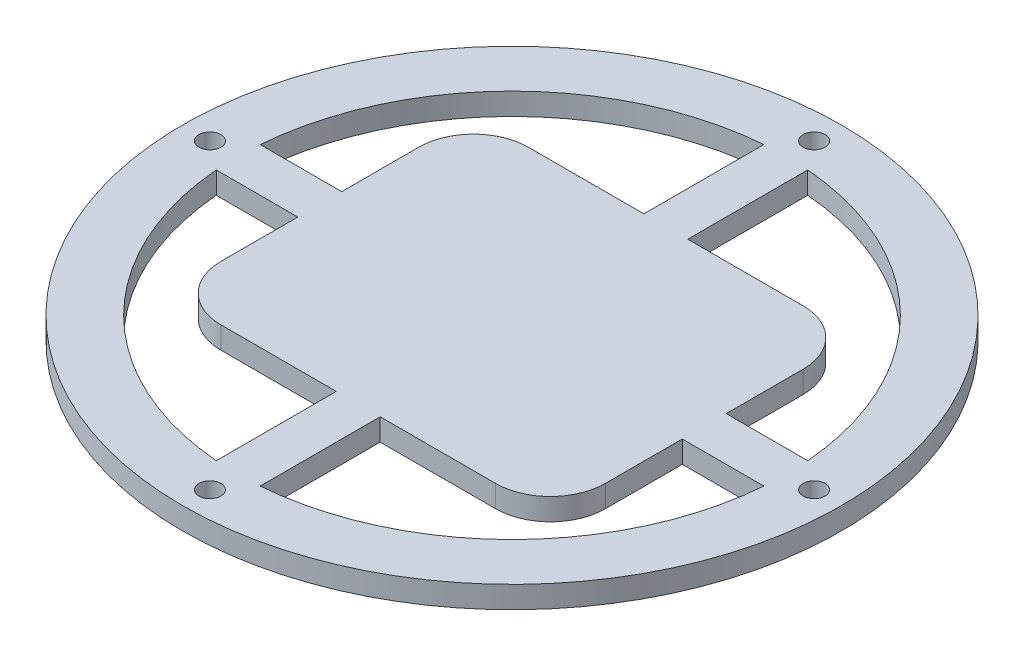
ISO-10303-21;
HEADER;
FILE_DESCRIPTION(('STEP AP214'),'2;1');
FILE_NAME('part.step','',(''),(''),'','','');
FILE_SCHEMA(('AUTOMOTIVE_DESIGN { 1 0 10303 214 1 1 1 1 }'));
ENDSEC;
DATA;
#1=APPLICATION_CONTEXT('core data for automotive mechanical design processes');
#2=APPLICATION_PROTOCOL_DEFINITION('international standard','automotive_design',2000,#1);
#3=PRODUCT_CONTEXT('',#1,'mechanical');
#4=PRODUCT('Part','Part','',(#3));
#5=PRODUCT_RELATED_PRODUCT_CATEGORY('part','',(#4));
#6=PRODUCT_DEFINITION_FORMATION('','',#4);
#7=PRODUCT_DEFINITION_CONTEXT('part definition',#1,'design');
#8=PRODUCT_DEFINITION('design','',#6,#7);
#9=PRODUCT_DEFINITION_SHAPE('','',#8);
#10=(LENGTH_UNIT() NAMED_UNIT(*) SI_UNIT(.MILLI.,.METRE.));
#11=(NAMED_UNIT(*) PLANE_ANGLE_UNIT() SI_UNIT($,.RADIAN.));
#12=(NAMED_UNIT(*) SI_UNIT($,.STERADIAN.) SOLID_ANGLE_UNIT());
#13=UNCERTAINTY_MEASURE_WITH_UNIT(LENGTH_MEASURE(1.E-05),#10,'distance_accuracy_value','');
#14=(GEOMETRIC_REPRESENTATION_CONTEXT(3) GLOBAL_UNCERTAINTY_ASSIGNED_CONTEXT((#13)) GLOBAL_UNIT_ASSIGNED_CONTEXT((#10,
#11,#12)) REPRESENTATION_CONTEXT('',''));
#15=CARTESIAN_POINT('',(0.,0.,0.));
#16=DIRECTION('',(0.,0.,1.));
#17=DIRECTION('',(1.,0.,0.));
#18=AXIS2_PLACEMENT_3D('',#15,#16,#17);
#19=CARTESIAN_POINT('',(0.,2.,0.));
#20=DIRECTION('',(0.,-1.,0.));
#21=DIRECTION('',(0.,0.,-1.));
#22=AXIS2_PLACEMENT_3D('',#19,#20,#21);
#23=CYLINDRICAL_SURFACE('',#22,25.);
#24=CARTESIAN_POINT('',(0.,2.,0.));
#25=DIRECTION('',(0.,1.,0.));
#26=DIRECTION('',(0.,0.,1.));
#27=AXIS2_PLACEMENT_3D('',#24,#25,#26);
#28=CIRCLE('',#27,25.);
#29=CARTESIAN_POINT('',(-2.,2.,-24.9198715887542));
#30=VERTEX_POINT('',#29);
#31=CARTESIAN_POINT('',(-24.9198715887542,2.,-2.));
#32=VERTEX_POINT('',#31);
#33=EDGE_CURVE('E211',#30,#32,#28,.T.);
#34=ORIENTED_EDGE('',*,*,#33,.T.);
#35=DIRECTION('',(0.,-1.,0.));
#36=VECTOR('',#35,1.);
#37=CARTESIAN_POINT('',(-24.9198715887542,2.,-2.));
#38=LINE('',#37,#36);
#39=CARTESIAN_POINT('',(-24.9198715887542,0.,-2.));
#40=VERTEX_POINT('',#39);
#41=EDGE_CURVE('E220',#32,#40,#38,.T.);
#42=ORIENTED_EDGE('',*,*,#41,.T.);
#43=CARTESIAN_POINT('',(0.,0.,0.));
#44=DIRECTION('',(0.,1.,0.));
#45=DIRECTION('',(0.,0.,1.));
#46=AXIS2_PLACEMENT_3D('',#43,#44,#45);
#47=CIRCLE('',#46,25.);
#48=CARTESIAN_POINT('',(-2.,0.,-24.9198715887542));
#49=VERTEX_POINT('',#48);
#50=EDGE_CURVE('E495',#49,#40,#47,.T.);
#51=ORIENTED_EDGE('',*,*,#50,.F.);
#52=DIRECTION('',(0.,-1.,0.));
#53=VECTOR('',#52,1.);
#54=CARTESIAN_POINT('',(-2.,2.,-24.9198715887542));
#55=LINE('',#54,#53);
#56=EDGE_CURVE('E233',#30,#49,#55,.T.);
#57=ORIENTED_EDGE('',*,*,#56,.F.);
#58=EDGE_LOOP('',(#34,#42,#51,#57));
#59=FACE_BOUND('',#58,.T.);
#60=ADVANCED_FACE('F41',(#59),#23,.F.);
#61=DIRECTION('',(0.,-1.,0.));
#62=VECTOR('',#61,1.);
#63=CARTESIAN_POINT('',(-24.9198715887542,2.,2.));
#64=LINE('',#63,#62);
#65=CARTESIAN_POINT('',(-24.9198715887542,2.,2.));
#66=VERTEX_POINT('',#65);
#67=CARTESIAN_POINT('',(-24.9198715887542,0.,2.));
#68=VERTEX_POINT('',#67);
#69=EDGE_CURVE('E229',#66,#68,#64,.T.);
#70=ORIENTED_EDGE('',*,*,#69,.F.);
#71=CARTESIAN_POINT('',(-2.,2.,24.9198715887542));
#72=VERTEX_POINT('',#71);
#73=EDGE_CURVE('E236',#66,#72,#28,.T.);
#74=ORIENTED_EDGE('',*,*,#73,.T.);
#75=DIRECTION('',(0.,-1.,0.));
#76=VECTOR('',#75,1.);
#77=CARTESIAN_POINT('',(-2.,2.,24.9198715887542));
#78=LINE('',#77,#76);
#79=CARTESIAN_POINT('',(-2.,0.,24.9198715887542));
#80=VERTEX_POINT('',#79);
#81=EDGE_CURVE('E390',#72,#80,#78,.T.);
#82=ORIENTED_EDGE('',*,*,#81,.T.);
#83=EDGE_CURVE('E254',#68,#80,#47,.T.);
#84=ORIENTED_EDGE('',*,*,#83,.F.);
#85=EDGE_LOOP('',(#70,#74,#82,#84));
#86=FACE_BOUND('',#85,.T.);
#87=ADVANCED_FACE('F454',(#86),#23,.F.);
#88=DIRECTION('',(0.,-1.,0.));
#89=VECTOR('',#88,1.);
#90=CARTESIAN_POINT('',(2.,2.,24.9198715887542));
#91=LINE('',#90,#89);
#92=CARTESIAN_POINT('',(2.,2.,24.9198715887542));
#93=VERTEX_POINT('',#92);
#94=CARTESIAN_POINT('',(2.,0.,24.9198715887542));
#95=VERTEX_POINT('',#94);
#96=EDGE_CURVE('E386',#93,#95,#91,.T.);
#97=ORIENTED_EDGE('',*,*,#96,.F.);
#98=CARTESIAN_POINT('',(24.9198715887542,2.,2.));
#99=VERTEX_POINT('',#98);
#100=EDGE_CURVE('E241',#93,#99,#28,.T.);
#101=ORIENTED_EDGE('',*,*,#100,.T.);
#102=DIRECTION('',(0.,-1.,0.));
#103=VECTOR('',#102,1.);
#104=CARTESIAN_POINT('',(24.9198715887542,2.,2.));
#105=LINE('',#104,#103);
#106=CARTESIAN_POINT('',(24.9198715887542,0.,2.));
#107=VERTEX_POINT('',#106);
#108=EDGE_CURVE('E375',#99,#107,#105,.T.);
#109=ORIENTED_EDGE('',*,*,#108,.T.);
#110=EDGE_CURVE('E243',#95,#107,#47,.T.);
#111=ORIENTED_EDGE('',*,*,#110,.F.);
#112=EDGE_LOOP('',(#97,#101,#109,#111));
#113=FACE_BOUND('',#112,.T.);
#114=ADVANCED_FACE('F459',(#113),#23,.F.);
#115=DIRECTION('',(0.,-1.,0.));
#116=VECTOR('',#115,1.);
#117=CARTESIAN_POINT('',(24.9198715887542,2.,-2.));
#118=LINE('',#117,#116);
#119=CARTESIAN_POINT('',(24.9198715887542,2.,-2.));
#120=VERTEX_POINT('',#119);
#121=CARTESIAN_POINT('',(24.9198715887542,0.,-2.));
#122=VERTEX_POINT('',#121);
#123=EDGE_CURVE('E371',#120,#122,#118,.T.);
#124=ORIENTED_EDGE('',*,*,#123,.F.);
#125=CARTESIAN_POINT('',(2.,2.,-24.9198715887542));
#126=VERTEX_POINT('',#125);
#127=EDGE_CURVE('E235',#120,#126,#28,.T.);
#128=ORIENTED_EDGE('',*,*,#127,.T.);
#129=DIRECTION('',(0.,-1.,0.));
#130=VECTOR('',#129,1.);
#131=CARTESIAN_POINT('',(2.,2.,-24.9198715887542));
#132=LINE('',#131,#130);
#133=CARTESIAN_POINT('',(2.,0.,-24.9198715887542));
#134=VERTEX_POINT('',#133);
#135=EDGE_CURVE('E360',#126,#134,#132,.T.);
#136=ORIENTED_EDGE('',*,*,#135,.T.);
#137=EDGE_CURVE('E253',#122,#134,#47,.T.);
#138=ORIENTED_EDGE('',*,*,#137,.F.);
#139=EDGE_LOOP('',(#124,#128,#136,#138));
#140=FACE_BOUND('',#139,.T.);
#141=ADVANCED_FACE('F455',(#140),#23,.F.);
#142=CARTESIAN_POINT('',(0.,2.,0.));
#143=DIRECTION('',(0.,1.,0.));
#144=DIRECTION('',(0.,0.,1.));
#145=AXIS2_PLACEMENT_3D('',#142,#143,#144);
#146=PLANE('',#145);
#147=DIRECTION('',(0.,0.,1.));
#148=VECTOR('',#147,1.);
#149=CARTESIAN_POINT('',(17.5,2.,0.));
#150=LINE('',#149,#148);
#151=CARTESIAN_POINT('',(17.5,2.,-9.));
#152=VERTEX_POINT('',#151);
#153=CARTESIAN_POINT('',(17.5,2.,-2.));
#154=VERTEX_POINT('',#153);
#155=EDGE_CURVE('E539',#152,#154,#150,.T.);
#156=ORIENTED_EDGE('',*,*,#155,.F.);
#157=CARTESIAN_POINT('',(12.5,2.,-9.));
#158=DIRECTION('',(0.,1.,0.));
#159=DIRECTION('',(0.,0.,1.));
#160=AXIS2_PLACEMENT_3D('',#157,#158,#159);
#161=CIRCLE('',#160,5.);
#162=CARTESIAN_POINT('',(12.5,2.,-14.));
#163=VERTEX_POINT('',#162);
#164=EDGE_CURVE('E283',#152,#163,#161,.T.);
#165=ORIENTED_EDGE('',*,*,#164,.T.);
#166=DIRECTION('',(1.,0.,0.));
#167=VECTOR('',#166,1.);
#168=CARTESIAN_POINT('',(0.,2.,-14.));
#169=LINE('',#168,#167);
#170=CARTESIAN_POINT('',(2.,2.,-14.));
#171=VERTEX_POINT('',#170);
#172=EDGE_CURVE('E484',#171,#163,#169,.T.);
#173=ORIENTED_EDGE('',*,*,#172,.F.);
#174=DIRECTION('',(0.,0.,-1.));
#175=VECTOR('',#174,1.);
#176=CARTESIAN_POINT('',(2.,2.,0.));
#177=LINE('',#176,#175);
#178=EDGE_CURVE('E481',#171,#126,#177,.T.);
#179=ORIENTED_EDGE('',*,*,#178,.T.);
#180=ORIENTED_EDGE('',*,*,#127,.F.);
#181=DIRECTION('',(1.,0.,0.));
#182=VECTOR('',#181,1.);
#183=CARTESIAN_POINT('',(0.,2.,-2.));
#184=LINE('',#183,#182);
#185=EDGE_CURVE('E478',#154,#120,#184,.T.);
#186=ORIENTED_EDGE('',*,*,#185,.F.);
#187=EDGE_LOOP('',(#156,#165,#173,#179,#180,#186));
#188=FACE_BOUND('',#187,.T.);
#189=DIRECTION('',(1.,0.,0.));
#190=VECTOR('',#189,1.);
#191=CARTESIAN_POINT('',(0.,2.,-14.));
#192=LINE('',#191,#190);
#193=CARTESIAN_POINT('',(-12.5,2.,-14.));
#194=VERTEX_POINT('',#193);
#195=CARTESIAN_POINT('',(-2.,2.,-14.));
#196=VERTEX_POINT('',#195);
#197=EDGE_CURVE('E532',#194,#196,#192,.T.);
#198=ORIENTED_EDGE('',*,*,#197,.F.);
#199=CARTESIAN_POINT('',(-12.5,2.,-9.));
#200=DIRECTION('',(0.,1.,0.));
#201=DIRECTION('',(0.,0.,1.));
#202=AXIS2_PLACEMENT_3D('',#199,#200,#201);
#203=CIRCLE('',#202,5.);
#204=CARTESIAN_POINT('',(-17.5,2.,-9.));
#205=VERTEX_POINT('',#204);
#206=EDGE_CURVE('E289',#194,#205,#203,.T.);
#207=ORIENTED_EDGE('',*,*,#206,.T.);
#208=DIRECTION('',(0.,0.,-1.));
#209=VECTOR('',#208,1.);
#210=CARTESIAN_POINT('',(-17.5,2.,0.));
#211=LINE('',#210,#209);
#212=CARTESIAN_POINT('',(-17.5,2.,-2.));
#213=VERTEX_POINT('',#212);
#214=EDGE_CURVE('E213',#213,#205,#211,.T.);
#215=ORIENTED_EDGE('',*,*,#214,.F.);
#216=DIRECTION('',(-1.,0.,0.));
#217=VECTOR('',#216,1.);
#218=CARTESIAN_POINT('',(0.,2.,-2.));
#219=LINE('',#218,#217);
#220=EDGE_CURVE('E204',#213,#32,#219,.T.);
#221=ORIENTED_EDGE('',*,*,#220,.T.);
#222=ORIENTED_EDGE('',*,*,#33,.F.);
#223=DIRECTION('',(0.,0.,-1.));
#224=VECTOR('',#223,1.);
#225=CARTESIAN_POINT('',(-2.,2.,0.));
#226=LINE('',#225,#224);
#227=EDGE_CURVE('E487',#196,#30,#226,.T.);
#228=ORIENTED_EDGE('',*,*,#227,.F.);
#229=EDGE_LOOP('',(#198,#207,#215,#221,#222,#228));
#230=FACE_BOUND('',#229,.T.);
#231=DIRECTION('',(0.,0.,-1.));
#232=VECTOR('',#231,1.);
#233=CARTESIAN_POINT('',(-17.5,2.,0.));
#234=LINE('',#233,#232);
#235=CARTESIAN_POINT('',(-17.5,2.,9.));
#236=VERTEX_POINT('',#235);
#237=CARTESIAN_POINT('',(-17.5,2.,2.));
#238=VERTEX_POINT('',#237);
#239=EDGE_CURVE('E561',#236,#238,#234,.T.);
#240=ORIENTED_EDGE('',*,*,#239,.F.);
#241=CARTESIAN_POINT('',(-12.5,2.,9.));
#242=DIRECTION('',(0.,1.,0.));
#243=DIRECTION('',(0.,0.,1.));
#244=AXIS2_PLACEMENT_3D('',#241,#242,#243);
#245=CIRCLE('',#244,5.);
#246=CARTESIAN_POINT('',(-12.5,2.,14.));
#247=VERTEX_POINT('',#246);
#248=EDGE_CURVE('E286',#236,#247,#245,.T.);
#249=ORIENTED_EDGE('',*,*,#248,.T.);
#250=DIRECTION('',(-1.,0.,0.));
#251=VECTOR('',#250,1.);
#252=CARTESIAN_POINT('',(0.,2.,14.));
#253=LINE('',#252,#251);
#254=CARTESIAN_POINT('',(-2.,2.,14.));
#255=VERTEX_POINT('',#254);
#256=EDGE_CURVE('E557',#255,#247,#253,.T.);
#257=ORIENTED_EDGE('',*,*,#256,.F.);
#258=DIRECTION('',(0.,0.,1.));
#259=VECTOR('',#258,1.);
#260=CARTESIAN_POINT('',(-2.,2.,0.));
#261=LINE('',#260,#259);
#262=EDGE_CURVE('E514',#255,#72,#261,.T.);
#263=ORIENTED_EDGE('',*,*,#262,.T.);
#264=ORIENTED_EDGE('',*,*,#73,.F.);
#265=DIRECTION('',(-1.,0.,0.));
#266=VECTOR('',#265,1.);
#267=CARTESIAN_POINT('',(0.,2.,2.));
#268=LINE('',#267,#266);
#269=EDGE_CURVE('E216',#238,#66,#268,.T.);
#270=ORIENTED_EDGE('',*,*,#269,.F.);
#271=EDGE_LOOP('',(#240,#249,#257,#263,#264,#270));
#272=FACE_BOUND('',#271,.T.);
#273=CARTESIAN_POINT('',(0.,2.,-27.5));
#274=DIRECTION('',(0.,1.,0.));
#275=DIRECTION('',(0.,0.,1.));
#276=AXIS2_PLACEMENT_3D('',#273,#274,#275);
#277=CIRCLE('',#276,1.);
#278=CARTESIAN_POINT('',(0.,2.,-26.5));
#279=VERTEX_POINT('',#278);
#280=EDGE_CURVE('E408',#279,#279,#277,.T.);
#281=ORIENTED_EDGE('',*,*,#280,.F.);
#282=EDGE_LOOP('',(#281));
#283=FACE_BOUND('',#282,.T.);
#284=CARTESIAN_POINT('',(27.5,2.,0.));
#285=DIRECTION('',(0.,1.,0.));
#286=DIRECTION('',(0.,0.,1.));
#287=AXIS2_PLACEMENT_3D('',#284,#285,#286);
#288=CIRCLE('',#287,1.);
#289=CARTESIAN_POINT('',(27.5,2.,1.));
#290=VERTEX_POINT('',#289);
#291=EDGE_CURVE('E412',#290,#290,#288,.T.);
#292=ORIENTED_EDGE('',*,*,#291,.F.);
#293=EDGE_LOOP('',(#292));
#294=FACE_BOUND('',#293,.T.);
#295=CARTESIAN_POINT('',(0.,2.,27.5));
#296=DIRECTION('',(0.,1.,0.));
#297=DIRECTION('',(0.,0.,1.));
#298=AXIS2_PLACEMENT_3D('',#295,#296,#297);
#299=CIRCLE('',#298,1.);
#300=CARTESIAN_POINT('',(0.,2.,28.5));
#301=VERTEX_POINT('',#300);
#302=EDGE_CURVE('E420',#301,#301,#299,.T.);
#303=ORIENTED_EDGE('',*,*,#302,.F.);
#304=EDGE_LOOP('',(#303));
#305=FACE_BOUND('',#304,.T.);
#306=CARTESIAN_POINT('',(-27.5,2.,0.));
#307=DIRECTION('',(0.,1.,0.));
#308=DIRECTION('',(0.,0.,1.));
#309=AXIS2_PLACEMENT_3D('',#306,#307,#308);
#310=CIRCLE('',#309,1.);
#311=CARTESIAN_POINT('',(-27.5,2.,1.));
#312=VERTEX_POINT('',#311);
#313=EDGE_CURVE('E427',#312,#312,#310,.T.);
#314=ORIENTED_EDGE('',*,*,#313,.F.);
#315=EDGE_LOOP('',(#314));
#316=FACE_BOUND('',#315,.T.);
#317=CARTESIAN_POINT('',(0.,2.,0.));
#318=DIRECTION('',(0.,1.,0.));
#319=DIRECTION('',(0.,0.,1.));
#320=AXIS2_PLACEMENT_3D('',#317,#318,#319);
#321=CIRCLE('',#320,30.);
#322=CARTESIAN_POINT('',(0.,2.,30.));
#323=VERTEX_POINT('',#322);
#324=EDGE_CURVE('E255',#323,#323,#321,.T.);
#325=ORIENTED_EDGE('',*,*,#324,.T.);
#326=EDGE_LOOP('',(#325));
#327=FACE_BOUND('',#326,.T.);
#328=DIRECTION('',(-1.,0.,0.));
#329=VECTOR('',#328,1.);
#330=CARTESIAN_POINT('',(0.,2.,14.));
#331=LINE('',#330,#329);
#332=CARTESIAN_POINT('',(12.5,2.,14.));
#333=VERTEX_POINT('',#332);
#334=CARTESIAN_POINT('',(2.,2.,14.));
#335=VERTEX_POINT('',#334);
#336=EDGE_CURVE('E549',#333,#335,#331,.T.);
#337=ORIENTED_EDGE('',*,*,#336,.F.);
#338=CARTESIAN_POINT('',(12.5,2.,9.));
#339=DIRECTION('',(0.,1.,0.));
#340=DIRECTION('',(0.,0.,1.));
#341=AXIS2_PLACEMENT_3D('',#338,#339,#340);
#342=CIRCLE('',#341,5.);
#343=CARTESIAN_POINT('',(17.5,2.,9.));
#344=VERTEX_POINT('',#343);
#345=EDGE_CURVE('E57',#333,#344,#342,.T.);
#346=ORIENTED_EDGE('',*,*,#345,.T.);
#347=DIRECTION('',(0.,0.,1.));
#348=VECTOR('',#347,1.);
#349=CARTESIAN_POINT('',(17.5,2.,0.));
#350=LINE('',#349,#348);
#351=CARTESIAN_POINT('',(17.5,2.,2.));
#352=VERTEX_POINT('',#351);
#353=EDGE_CURVE('E313',#352,#344,#350,.T.);
#354=ORIENTED_EDGE('',*,*,#353,.F.);
#355=DIRECTION('',(1.,0.,0.));
#356=VECTOR('',#355,1.);
#357=CARTESIAN_POINT('',(0.,2.,2.));
#358=LINE('',#357,#356);
#359=EDGE_CURVE('E544',#352,#99,#358,.T.);
#360=ORIENTED_EDGE('',*,*,#359,.T.);
#361=ORIENTED_EDGE('',*,*,#100,.F.);
#362=DIRECTION('',(0.,0.,1.));
#363=VECTOR('',#362,1.);
#364=CARTESIAN_POINT('',(2.,2.,0.));
#365=LINE('',#364,#363);
#366=EDGE_CURVE('E552',#335,#93,#365,.T.);
#367=ORIENTED_EDGE('',*,*,#366,.F.);
#368=EDGE_LOOP('',(#337,#346,#354,#360,#361,#367));
#369=FACE_BOUND('',#368,.T.);
#370=ADVANCED_FACE('F207',(#188,#230,#272,#283,#294,#305,#316,#327,#369),#146,.T.);
#371=CARTESIAN_POINT('',(0.,0.,0.));
#372=DIRECTION('',(0.,1.,0.));
#373=DIRECTION('',(0.,0.,1.));
#374=AXIS2_PLACEMENT_3D('',#371,#372,#373);
#375=PLANE('',#374);
#376=DIRECTION('',(1.,0.,0.));
#377=VECTOR('',#376,1.);
#378=CARTESIAN_POINT('',(0.,0.,-14.));
#379=LINE('',#378,#377);
#380=CARTESIAN_POINT('',(2.,0.,-14.));
#381=VERTEX_POINT('',#380);
#382=CARTESIAN_POINT('',(12.5,0.,-14.));
#383=VERTEX_POINT('',#382);
#384=EDGE_CURVE('E335',#381,#383,#379,.T.);
#385=ORIENTED_EDGE('',*,*,#384,.T.);
#386=CARTESIAN_POINT('',(12.5,0.,-9.));
#387=DIRECTION('',(0.,1.,0.));
#388=DIRECTION('',(0.,0.,1.));
#389=AXIS2_PLACEMENT_3D('',#386,#387,#388);
#390=CIRCLE('',#389,5.);
#391=CARTESIAN_POINT('',(17.5,0.,-9.));
#392=VERTEX_POINT('',#391);
#393=EDGE_CURVE('E269',#383,#392,#390,.F.);
#394=ORIENTED_EDGE('',*,*,#393,.T.);
#395=DIRECTION('',(0.,0.,1.));
#396=VECTOR('',#395,1.);
#397=CARTESIAN_POINT('',(17.5,0.,0.));
#398=LINE('',#397,#396);
#399=CARTESIAN_POINT('',(17.5,0.,-2.));
#400=VERTEX_POINT('',#399);
#401=EDGE_CURVE('E332',#392,#400,#398,.T.);
#402=ORIENTED_EDGE('',*,*,#401,.T.);
#403=DIRECTION('',(1.,0.,0.));
#404=VECTOR('',#403,1.);
#405=CARTESIAN_POINT('',(0.,0.,-2.));
#406=LINE('',#405,#404);
#407=EDGE_CURVE('E324',#400,#122,#406,.T.);
#408=ORIENTED_EDGE('',*,*,#407,.T.);
#409=ORIENTED_EDGE('',*,*,#137,.T.);
#410=DIRECTION('',(0.,0.,-1.));
#411=VECTOR('',#410,1.);
#412=CARTESIAN_POINT('',(2.,0.,0.));
#413=LINE('',#412,#411);
#414=EDGE_CURVE('E339',#381,#134,#413,.T.);
#415=ORIENTED_EDGE('',*,*,#414,.F.);
#416=EDGE_LOOP('',(#385,#394,#402,#408,#409,#415));
#417=FACE_BOUND('',#416,.T.);
#418=DIRECTION('',(0.,0.,-1.));
#419=VECTOR('',#418,1.);
#420=CARTESIAN_POINT('',(-17.5,0.,0.));
#421=LINE('',#420,#419);
#422=CARTESIAN_POINT('',(-17.5,0.,-2.));
#423=VERTEX_POINT('',#422);
#424=CARTESIAN_POINT('',(-17.5,0.,-9.));
#425=VERTEX_POINT('',#424);
#426=EDGE_CURVE('E217',#423,#425,#421,.T.);
#427=ORIENTED_EDGE('',*,*,#426,.T.);
#428=CARTESIAN_POINT('',(-12.5,0.,-9.));
#429=DIRECTION('',(0.,1.,0.));
#430=DIRECTION('',(0.,0.,1.));
#431=AXIS2_PLACEMENT_3D('',#428,#429,#430);
#432=CIRCLE('',#431,5.);
#433=CARTESIAN_POINT('',(-12.5,0.,-14.));
#434=VERTEX_POINT('',#433);
#435=EDGE_CURVE('E275',#425,#434,#432,.F.);
#436=ORIENTED_EDGE('',*,*,#435,.T.);
#437=DIRECTION('',(1.,0.,0.));
#438=VECTOR('',#437,1.);
#439=CARTESIAN_POINT('',(0.,0.,-14.));
#440=LINE('',#439,#438);
#441=CARTESIAN_POINT('',(-2.,0.,-14.));
#442=VERTEX_POINT('',#441);
#443=EDGE_CURVE('E345',#434,#442,#440,.T.);
#444=ORIENTED_EDGE('',*,*,#443,.T.);
#445=DIRECTION('',(0.,0.,-1.));
#446=VECTOR('',#445,1.);
#447=CARTESIAN_POINT('',(-2.,0.,0.));
#448=LINE('',#447,#446);
#449=EDGE_CURVE('E342',#442,#49,#448,.T.);
#450=ORIENTED_EDGE('',*,*,#449,.T.);
#451=ORIENTED_EDGE('',*,*,#50,.T.);
#452=DIRECTION('',(-1.,0.,0.));
#453=VECTOR('',#452,1.);
#454=CARTESIAN_POINT('',(0.,0.,-2.));
#455=LINE('',#454,#453);
#456=EDGE_CURVE('E223',#423,#40,#455,.T.);
#457=ORIENTED_EDGE('',*,*,#456,.F.);
#458=EDGE_LOOP('',(#427,#436,#444,#450,#451,#457));
#459=FACE_BOUND('',#458,.T.);
#460=DIRECTION('',(-1.,0.,0.));
#461=VECTOR('',#460,1.);
#462=CARTESIAN_POINT('',(0.,0.,14.));
#463=LINE('',#462,#461);
#464=CARTESIAN_POINT('',(-2.,0.,14.));
#465=VERTEX_POINT('',#464);
#466=CARTESIAN_POINT('',(-12.5,0.,14.));
#467=VERTEX_POINT('',#466);
#468=EDGE_CURVE('E517',#465,#467,#463,.T.);
#469=ORIENTED_EDGE('',*,*,#468,.T.);
#470=CARTESIAN_POINT('',(-12.5,0.,9.));
#471=DIRECTION('',(0.,1.,0.));
#472=DIRECTION('',(0.,0.,1.));
#473=AXIS2_PLACEMENT_3D('',#470,#471,#472);
#474=CIRCLE('',#473,5.);
#475=CARTESIAN_POINT('',(-17.5,0.,9.));
#476=VERTEX_POINT('',#475);
#477=EDGE_CURVE('E272',#467,#476,#474,.F.);
#478=ORIENTED_EDGE('',*,*,#477,.T.);
#479=DIRECTION('',(0.,0.,-1.));
#480=VECTOR('',#479,1.);
#481=CARTESIAN_POINT('',(-17.5,0.,0.));
#482=LINE('',#481,#480);
#483=CARTESIAN_POINT('',(-17.5,0.,2.));
#484=VERTEX_POINT('',#483);
#485=EDGE_CURVE('E521',#476,#484,#482,.T.);
#486=ORIENTED_EDGE('',*,*,#485,.T.);
#487=DIRECTION('',(-1.,0.,0.));
#488=VECTOR('',#487,1.);
#489=CARTESIAN_POINT('',(0.,0.,2.));
#490=LINE('',#489,#488);
#491=EDGE_CURVE('E507',#484,#68,#490,.T.);
#492=ORIENTED_EDGE('',*,*,#491,.T.);
#493=ORIENTED_EDGE('',*,*,#83,.T.);
#494=DIRECTION('',(0.,0.,1.));
#495=VECTOR('',#494,1.);
#496=CARTESIAN_POINT('',(-2.,0.,0.));
#497=LINE('',#496,#495);
#498=EDGE_CURVE('E504',#465,#80,#497,.T.);
#499=ORIENTED_EDGE('',*,*,#498,.F.);
#500=EDGE_LOOP('',(#469,#478,#486,#492,#493,#499));
#501=FACE_BOUND('',#500,.T.);
#502=CARTESIAN_POINT('',(0.,0.,-27.5));
#503=DIRECTION('',(0.,1.,0.));
#504=DIRECTION('',(0.,0.,1.));
#505=AXIS2_PLACEMENT_3D('',#502,#503,#504);
#506=CIRCLE('',#505,1.);
#507=CARTESIAN_POINT('',(0.,0.,-26.5));
#508=VERTEX_POINT('',#507);
#509=EDGE_CURVE('E404',#508,#508,#506,.T.);
#510=ORIENTED_EDGE('',*,*,#509,.T.);
#511=EDGE_LOOP('',(#510));
#512=FACE_BOUND('',#511,.T.);
#513=CARTESIAN_POINT('',(27.5,0.,0.));
#514=DIRECTION('',(0.,1.,0.));
#515=DIRECTION('',(0.,0.,1.));
#516=AXIS2_PLACEMENT_3D('',#513,#514,#515);
#517=CIRCLE('',#516,1.);
#518=CARTESIAN_POINT('',(27.5,0.,1.));
#519=VERTEX_POINT('',#518);
#520=EDGE_CURVE('E416',#519,#519,#517,.T.);
#521=ORIENTED_EDGE('',*,*,#520,.T.);
#522=EDGE_LOOP('',(#521));
#523=FACE_BOUND('',#522,.T.);
#524=CARTESIAN_POINT('',(0.,0.,27.5));
#525=DIRECTION('',(0.,1.,0.));
#526=DIRECTION('',(0.,0.,1.));
#527=AXIS2_PLACEMENT_3D('',#524,#525,#526);
#528=CIRCLE('',#527,1.);
#529=CARTESIAN_POINT('',(0.,0.,28.5));
#530=VERTEX_POINT('',#529);
#531=EDGE_CURVE('E424',#530,#530,#528,.T.);
#532=ORIENTED_EDGE('',*,*,#531,.T.);
#533=EDGE_LOOP('',(#532));
#534=FACE_BOUND('',#533,.T.);
#535=CARTESIAN_POINT('',(-27.5,0.,0.));
#536=DIRECTION('',(0.,1.,0.));
#537=DIRECTION('',(0.,0.,1.));
#538=AXIS2_PLACEMENT_3D('',#535,#536,#537);
#539=CIRCLE('',#538,1.);
#540=CARTESIAN_POINT('',(-27.5,0.,1.));
#541=VERTEX_POINT('',#540);
#542=EDGE_CURVE('E228',#541,#541,#539,.T.);
#543=ORIENTED_EDGE('',*,*,#542,.T.);
#544=EDGE_LOOP('',(#543));
#545=FACE_BOUND('',#544,.T.);
#546=CARTESIAN_POINT('',(0.,0.,0.));
#547=DIRECTION('',(0.,1.,0.));
#548=DIRECTION('',(0.,0.,1.));
#549=AXIS2_PLACEMENT_3D('',#546,#547,#548);
#550=CIRCLE('',#549,30.);
#551=CARTESIAN_POINT('',(0.,0.,30.));
#552=VERTEX_POINT('',#551);
#553=EDGE_CURVE('E248',#552,#552,#550,.T.);
#554=ORIENTED_EDGE('',*,*,#553,.F.);
#555=EDGE_LOOP('',(#554));
#556=FACE_BOUND('',#555,.T.);
#557=DIRECTION('',(0.,0.,1.));
#558=VECTOR('',#557,1.);
#559=CARTESIAN_POINT('',(17.5,0.,0.));
#560=LINE('',#559,#558);
#561=CARTESIAN_POINT('',(17.5,0.,2.));
#562=VERTEX_POINT('',#561);
#563=CARTESIAN_POINT('',(17.5,0.,9.));
#564=VERTEX_POINT('',#563);
#565=EDGE_CURVE('E312',#562,#564,#560,.T.);
#566=ORIENTED_EDGE('',*,*,#565,.T.);
#567=CARTESIAN_POINT('',(12.5,0.,9.));
#568=DIRECTION('',(0.,1.,0.));
#569=DIRECTION('',(0.,0.,1.));
#570=AXIS2_PLACEMENT_3D('',#567,#568,#569);
#571=CIRCLE('',#570,5.);
#572=CARTESIAN_POINT('',(12.5,0.,14.));
#573=VERTEX_POINT('',#572);
#574=EDGE_CURVE('E266',#564,#573,#571,.F.);
#575=ORIENTED_EDGE('',*,*,#574,.T.);
#576=DIRECTION('',(-1.,0.,0.));
#577=VECTOR('',#576,1.);
#578=CARTESIAN_POINT('',(0.,0.,14.));
#579=LINE('',#578,#577);
#580=CARTESIAN_POINT('',(2.,0.,14.));
#581=VERTEX_POINT('',#580);
#582=EDGE_CURVE('E320',#573,#581,#579,.T.);
#583=ORIENTED_EDGE('',*,*,#582,.T.);
#584=DIRECTION('',(0.,0.,1.));
#585=VECTOR('',#584,1.);
#586=CARTESIAN_POINT('',(2.,0.,0.));
#587=LINE('',#586,#585);
#588=EDGE_CURVE('E326',#581,#95,#587,.T.);
#589=ORIENTED_EDGE('',*,*,#588,.T.);
#590=ORIENTED_EDGE('',*,*,#110,.T.);
#591=DIRECTION('',(1.,0.,0.));
#592=VECTOR('',#591,1.);
#593=CARTESIAN_POINT('',(0.,0.,2.));
#594=LINE('',#593,#592);
#595=EDGE_CURVE('E318',#562,#107,#594,.T.);
#596=ORIENTED_EDGE('',*,*,#595,.F.);
#597=EDGE_LOOP('',(#566,#575,#583,#589,#590,#596));
#598=FACE_BOUND('',#597,.T.);
#599=ADVANCED_FACE('F317',(#417,#459,#501,#512,#523,#534,#545,#556,#598),#375,.F.);
#600=CARTESIAN_POINT('',(0.,2.,0.));
#601=DIRECTION('',(0.,-1.,0.));
#602=DIRECTION('',(0.,0.,-1.));
#603=AXIS2_PLACEMENT_3D('',#600,#601,#602);
#604=CYLINDRICAL_SURFACE('',#603,30.);
#605=ORIENTED_EDGE('',*,*,#324,.F.);
#606=EDGE_LOOP('',(#605));
#607=FACE_BOUND('',#606,.T.);
#608=ORIENTED_EDGE('',*,*,#553,.T.);
#609=EDGE_LOOP('',(#608));
#610=FACE_BOUND('',#609,.T.);
#611=ADVANCED_FACE('F441',(#607,#610),#604,.T.);
#612=CARTESIAN_POINT('',(-27.5,0.,0.));
#613=DIRECTION('',(0.,1.,0.));
#614=DIRECTION('',(0.,0.,1.));
#615=AXIS2_PLACEMENT_3D('',#612,#613,#614);
#616=CYLINDRICAL_SURFACE('',#615,1.);
#617=ORIENTED_EDGE('',*,*,#542,.F.);
#618=EDGE_LOOP('',(#617));
#619=FACE_BOUND('',#618,.T.);
#620=ORIENTED_EDGE('',*,*,#313,.T.);
#621=EDGE_LOOP('',(#620));
#622=FACE_BOUND('',#621,.T.);
#623=ADVANCED_FACE('F438',(#619,#622),#616,.F.);
#624=CARTESIAN_POINT('',(0.,0.,27.5));
#625=DIRECTION('',(0.,1.,0.));
#626=DIRECTION('',(0.,0.,1.));
#627=AXIS2_PLACEMENT_3D('',#624,#625,#626);
#628=CYLINDRICAL_SURFACE('',#627,1.);
#629=ORIENTED_EDGE('',*,*,#531,.F.);
#630=EDGE_LOOP('',(#629));
#631=FACE_BOUND('',#630,.T.);
#632=ORIENTED_EDGE('',*,*,#302,.T.);
#633=EDGE_LOOP('',(#632));
#634=FACE_BOUND('',#633,.T.);
#635=ADVANCED_FACE('F440',(#631,#634),#628,.F.);
#636=CARTESIAN_POINT('',(27.5,0.,0.));
#637=DIRECTION('',(0.,1.,0.));
#638=DIRECTION('',(0.,0.,1.));
#639=AXIS2_PLACEMENT_3D('',#636,#637,#638);
#640=CYLINDRICAL_SURFACE('',#639,1.);
#641=ORIENTED_EDGE('',*,*,#520,.F.);
#642=EDGE_LOOP('',(#641));
#643=FACE_BOUND('',#642,.T.);
#644=ORIENTED_EDGE('',*,*,#291,.T.);
#645=EDGE_LOOP('',(#644));
#646=FACE_BOUND('',#645,.T.);
#647=ADVANCED_FACE('F447',(#643,#646),#640,.F.);
#648=CARTESIAN_POINT('',(0.,0.,-27.5));
#649=DIRECTION('',(0.,1.,0.));
#650=DIRECTION('',(0.,0.,1.));
#651=AXIS2_PLACEMENT_3D('',#648,#649,#650);
#652=CYLINDRICAL_SURFACE('',#651,1.);
#653=ORIENTED_EDGE('',*,*,#509,.F.);
#654=EDGE_LOOP('',(#653));
#655=FACE_BOUND('',#654,.T.);
#656=ORIENTED_EDGE('',*,*,#280,.T.);
#657=EDGE_LOOP('',(#656));
#658=FACE_BOUND('',#657,.T.);
#659=ADVANCED_FACE('F593',(#655,#658),#652,.F.);
#660=CARTESIAN_POINT('',(0.,2.,-2.));
#661=DIRECTION('',(0.,0.,1.));
#662=DIRECTION('',(1.,0.,0.));
#663=AXIS2_PLACEMENT_3D('',#660,#661,#662);
#664=PLANE('',#663);
#665=ORIENTED_EDGE('',*,*,#456,.T.);
#666=ORIENTED_EDGE('',*,*,#41,.F.);
#667=ORIENTED_EDGE('',*,*,#220,.F.);
#668=DIRECTION('',(0.,-1.,0.));
#669=VECTOR('',#668,1.);
#670=CARTESIAN_POINT('',(-17.5,2.,-2.));
#671=LINE('',#670,#669);
#672=EDGE_CURVE('E351',#213,#423,#671,.T.);
#673=ORIENTED_EDGE('',*,*,#672,.T.);
#674=EDGE_LOOP('',(#665,#666,#667,#673));
#675=FACE_BOUND('',#674,.T.);
#676=ADVANCED_FACE('F221',(#675),#664,.F.);
#677=CARTESIAN_POINT('',(0.,2.,2.));
#678=DIRECTION('',(0.,0.,1.));
#679=DIRECTION('',(1.,0.,0.));
#680=AXIS2_PLACEMENT_3D('',#677,#678,#679);
#681=PLANE('',#680);
#682=ORIENTED_EDGE('',*,*,#491,.F.);
#683=DIRECTION('',(0.,-1.,0.));
#684=VECTOR('',#683,1.);
#685=CARTESIAN_POINT('',(-17.5,2.,2.));
#686=LINE('',#685,#684);
#687=EDGE_CURVE('E397',#238,#484,#686,.T.);
#688=ORIENTED_EDGE('',*,*,#687,.F.);
#689=ORIENTED_EDGE('',*,*,#269,.T.);
#690=ORIENTED_EDGE('',*,*,#69,.T.);
#691=EDGE_LOOP('',(#682,#688,#689,#690));
#692=FACE_BOUND('',#691,.T.);
#693=ADVANCED_FACE('F568',(#692),#681,.T.);
#694=CARTESIAN_POINT('',(-17.5,2.,0.));
#695=DIRECTION('',(-1.,0.,0.));
#696=DIRECTION('',(0.,0.,1.));
#697=AXIS2_PLACEMENT_3D('',#694,#695,#696);
#698=PLANE('',#697);
#699=ORIENTED_EDGE('',*,*,#485,.F.);
#700=DIRECTION('',(0.,-1.,0.));
#701=VECTOR('',#700,1.);
#702=CARTESIAN_POINT('',(-17.5,2.,9.));
#703=LINE('',#702,#701);
#704=EDGE_CURVE('E296',#476,#236,#703,.F.);
#705=ORIENTED_EDGE('',*,*,#704,.T.);
#706=ORIENTED_EDGE('',*,*,#239,.T.);
#707=ORIENTED_EDGE('',*,*,#687,.T.);
#708=EDGE_LOOP('',(#699,#705,#706,#707));
#709=FACE_BOUND('',#708,.T.);
#710=ADVANCED_FACE('F580',(#709),#698,.T.);
#711=CARTESIAN_POINT('',(0.,2.,14.));
#712=DIRECTION('',(0.,0.,1.));
#713=DIRECTION('',(1.,0.,0.));
#714=AXIS2_PLACEMENT_3D('',#711,#712,#713);
#715=PLANE('',#714);
#716=ORIENTED_EDGE('',*,*,#256,.T.);
#717=DIRECTION('',(0.,-1.,0.));
#718=VECTOR('',#717,1.);
#719=CARTESIAN_POINT('',(-12.5,2.,14.));
#720=LINE('',#719,#718);
#721=EDGE_CURVE('E292',#247,#467,#720,.T.);
#722=ORIENTED_EDGE('',*,*,#721,.T.);
#723=ORIENTED_EDGE('',*,*,#468,.F.);
#724=DIRECTION('',(0.,-1.,0.));
#725=VECTOR('',#724,1.);
#726=CARTESIAN_POINT('',(-2.,2.,14.));
#727=LINE('',#726,#725);
#728=EDGE_CURVE('E394',#255,#465,#727,.T.);
#729=ORIENTED_EDGE('',*,*,#728,.F.);
#730=EDGE_LOOP('',(#716,#722,#723,#729));
#731=FACE_BOUND('',#730,.T.);
#732=ADVANCED_FACE('F574',(#731),#715,.T.);
#733=CARTESIAN_POINT('',(-2.,2.,0.));
#734=DIRECTION('',(1.,0.,0.));
#735=DIRECTION('',(0.,0.,-1.));
#736=AXIS2_PLACEMENT_3D('',#733,#734,#735);
#737=PLANE('',#736);
#738=ORIENTED_EDGE('',*,*,#498,.T.);
#739=ORIENTED_EDGE('',*,*,#81,.F.);
#740=ORIENTED_EDGE('',*,*,#262,.F.);
#741=ORIENTED_EDGE('',*,*,#728,.T.);
#742=EDGE_LOOP('',(#738,#739,#740,#741));
#743=FACE_BOUND('',#742,.T.);
#744=ADVANCED_FACE('F513',(#743),#737,.F.);
#745=CARTESIAN_POINT('',(2.,2.,0.));
#746=DIRECTION('',(1.,0.,0.));
#747=DIRECTION('',(0.,0.,-1.));
#748=AXIS2_PLACEMENT_3D('',#745,#746,#747);
#749=PLANE('',#748);
#750=ORIENTED_EDGE('',*,*,#588,.F.);
#751=DIRECTION('',(0.,-1.,0.));
#752=VECTOR('',#751,1.);
#753=CARTESIAN_POINT('',(2.,2.,14.));
#754=LINE('',#753,#752);
#755=EDGE_CURVE('E382',#335,#581,#754,.T.);
#756=ORIENTED_EDGE('',*,*,#755,.F.);
#757=ORIENTED_EDGE('',*,*,#366,.T.);
#758=ORIENTED_EDGE('',*,*,#96,.T.);
#759=EDGE_LOOP('',(#750,#756,#757,#758));
#760=FACE_BOUND('',#759,.T.);
#761=ADVANCED_FACE('F703',(#760),#749,.T.);
#762=CARTESIAN_POINT('',(0.,2.,14.));
#763=DIRECTION('',(0.,0.,1.));
#764=DIRECTION('',(1.,0.,0.));
#765=AXIS2_PLACEMENT_3D('',#762,#763,#764);
#766=PLANE('',#765);
#767=ORIENTED_EDGE('',*,*,#582,.F.);
#768=DIRECTION('',(0.,-1.,0.));
#769=VECTOR('',#768,1.);
#770=CARTESIAN_POINT('',(12.5,2.,14.));
#771=LINE('',#770,#769);
#772=EDGE_CURVE('E11',#573,#333,#771,.F.);
#773=ORIENTED_EDGE('',*,*,#772,.T.);
#774=ORIENTED_EDGE('',*,*,#336,.T.);
#775=ORIENTED_EDGE('',*,*,#755,.T.);
#776=EDGE_LOOP('',(#767,#773,#774,#775));
#777=FACE_BOUND('',#776,.T.);
#778=ADVANCED_FACE('F712',(#777),#766,.T.);
#779=CARTESIAN_POINT('',(17.5,2.,0.));
#780=DIRECTION('',(1.,0.,0.));
#781=DIRECTION('',(0.,0.,-1.));
#782=AXIS2_PLACEMENT_3D('',#779,#780,#781);
#783=PLANE('',#782);
#784=ORIENTED_EDGE('',*,*,#353,.T.);
#785=DIRECTION('',(0.,-1.,0.));
#786=VECTOR('',#785,1.);
#787=CARTESIAN_POINT('',(17.5,2.,9.));
#788=LINE('',#787,#786);
#789=EDGE_CURVE('E50',#344,#564,#788,.T.);
#790=ORIENTED_EDGE('',*,*,#789,.T.);
#791=ORIENTED_EDGE('',*,*,#565,.F.);
#792=DIRECTION('',(0.,-1.,0.));
#793=VECTOR('',#792,1.);
#794=CARTESIAN_POINT('',(17.5,2.,2.));
#795=LINE('',#794,#793);
#796=EDGE_CURVE('E379',#352,#562,#795,.T.);
#797=ORIENTED_EDGE('',*,*,#796,.F.);
#798=EDGE_LOOP('',(#784,#790,#791,#797));
#799=FACE_BOUND('',#798,.T.);
#800=ADVANCED_FACE('F311',(#799),#783,.T.);
#801=CARTESIAN_POINT('',(0.,2.,2.));
#802=DIRECTION('',(0.,0.,-1.));
#803=DIRECTION('',(-1.,0.,0.));
#804=AXIS2_PLACEMENT_3D('',#801,#802,#803);
#805=PLANE('',#804);
#806=ORIENTED_EDGE('',*,*,#595,.T.);
#807=ORIENTED_EDGE('',*,*,#108,.F.);
#808=ORIENTED_EDGE('',*,*,#359,.F.);
#809=ORIENTED_EDGE('',*,*,#796,.T.);
#810=EDGE_LOOP('',(#806,#807,#808,#809));
#811=FACE_BOUND('',#810,.T.);
#812=ADVANCED_FACE('F720',(#811),#805,.F.);
#813=CARTESIAN_POINT('',(0.,2.,-2.));
#814=DIRECTION('',(0.,0.,-1.));
#815=DIRECTION('',(-1.,0.,0.));
#816=AXIS2_PLACEMENT_3D('',#813,#814,#815);
#817=PLANE('',#816);
#818=ORIENTED_EDGE('',*,*,#407,.F.);
#819=DIRECTION('',(0.,-1.,0.));
#820=VECTOR('',#819,1.);
#821=CARTESIAN_POINT('',(17.5,2.,-2.));
#822=LINE('',#821,#820);
#823=EDGE_CURVE('E367',#154,#400,#822,.T.);
#824=ORIENTED_EDGE('',*,*,#823,.F.);
#825=ORIENTED_EDGE('',*,*,#185,.T.);
#826=ORIENTED_EDGE('',*,*,#123,.T.);
#827=EDGE_LOOP('',(#818,#824,#825,#826));
#828=FACE_BOUND('',#827,.T.);
#829=ADVANCED_FACE('F725',(#828),#817,.T.);
#830=CARTESIAN_POINT('',(17.5,2.,0.));
#831=DIRECTION('',(1.,0.,0.));
#832=DIRECTION('',(0.,0.,-1.));
#833=AXIS2_PLACEMENT_3D('',#830,#831,#832);
#834=PLANE('',#833);
#835=ORIENTED_EDGE('',*,*,#401,.F.);
#836=DIRECTION('',(0.,-1.,0.));
#837=VECTOR('',#836,1.);
#838=CARTESIAN_POINT('',(17.5,2.,-9.));
#839=LINE('',#838,#837);
#840=EDGE_CURVE('E303',#392,#152,#839,.F.);
#841=ORIENTED_EDGE('',*,*,#840,.T.);
#842=ORIENTED_EDGE('',*,*,#155,.T.);
#843=ORIENTED_EDGE('',*,*,#823,.T.);
#844=EDGE_LOOP('',(#835,#841,#842,#843));
#845=FACE_BOUND('',#844,.T.);
#846=ADVANCED_FACE('F737',(#845),#834,.T.);
#847=CARTESIAN_POINT('',(0.,2.,-14.));
#848=DIRECTION('',(0.,0.,-1.));
#849=DIRECTION('',(-1.,0.,0.));
#850=AXIS2_PLACEMENT_3D('',#847,#848,#849);
#851=PLANE('',#850);
#852=ORIENTED_EDGE('',*,*,#172,.T.);
#853=DIRECTION('',(0.,-1.,0.));
#854=VECTOR('',#853,1.);
#855=CARTESIAN_POINT('',(12.5,2.,-14.));
#856=LINE('',#855,#854);
#857=EDGE_CURVE('E299',#163,#383,#856,.T.);
#858=ORIENTED_EDGE('',*,*,#857,.T.);
#859=ORIENTED_EDGE('',*,*,#384,.F.);
#860=DIRECTION('',(0.,-1.,0.));
#861=VECTOR('',#860,1.);
#862=CARTESIAN_POINT('',(2.,2.,-14.));
#863=LINE('',#862,#861);
#864=EDGE_CURVE('E364',#171,#381,#863,.T.);
#865=ORIENTED_EDGE('',*,*,#864,.F.);
#866=EDGE_LOOP('',(#852,#858,#859,#865));
#867=FACE_BOUND('',#866,.T.);
#868=ADVANCED_FACE('F749',(#867),#851,.T.);
#869=CARTESIAN_POINT('',(2.,2.,0.));
#870=DIRECTION('',(-1.,0.,0.));
#871=DIRECTION('',(0.,0.,1.));
#872=AXIS2_PLACEMENT_3D('',#869,#870,#871);
#873=PLANE('',#872);
#874=ORIENTED_EDGE('',*,*,#414,.T.);
#875=ORIENTED_EDGE('',*,*,#135,.F.);
#876=ORIENTED_EDGE('',*,*,#178,.F.);
#877=ORIENTED_EDGE('',*,*,#864,.T.);
#878=EDGE_LOOP('',(#874,#875,#876,#877));
#879=FACE_BOUND('',#878,.T.);
#880=ADVANCED_FACE('F489',(#879),#873,.F.);
#881=CARTESIAN_POINT('',(-2.,2.,0.));
#882=DIRECTION('',(-1.,0.,0.));
#883=DIRECTION('',(0.,0.,1.));
#884=AXIS2_PLACEMENT_3D('',#881,#882,#883);
#885=PLANE('',#884);
#886=ORIENTED_EDGE('',*,*,#449,.F.);
#887=DIRECTION('',(0.,-1.,0.));
#888=VECTOR('',#887,1.);
#889=CARTESIAN_POINT('',(-2.,2.,-14.));
#890=LINE('',#889,#888);
#891=EDGE_CURVE('E354',#196,#442,#890,.T.);
#892=ORIENTED_EDGE('',*,*,#891,.F.);
#893=ORIENTED_EDGE('',*,*,#227,.T.);
#894=ORIENTED_EDGE('',*,*,#56,.T.);
#895=EDGE_LOOP('',(#886,#892,#893,#894));
#896=FACE_BOUND('',#895,.T.);
#897=ADVANCED_FACE('F748',(#896),#885,.T.);
#898=CARTESIAN_POINT('',(0.,2.,-14.));
#899=DIRECTION('',(0.,0.,-1.));
#900=DIRECTION('',(-1.,0.,0.));
#901=AXIS2_PLACEMENT_3D('',#898,#899,#900);
#902=PLANE('',#901);
#903=ORIENTED_EDGE('',*,*,#443,.F.);
#904=DIRECTION('',(0.,-1.,0.));
#905=VECTOR('',#904,1.);
#906=CARTESIAN_POINT('',(-12.5,2.,-14.));
#907=LINE('',#906,#905);
#908=EDGE_CURVE('E278',#434,#194,#907,.F.);
#909=ORIENTED_EDGE('',*,*,#908,.T.);
#910=ORIENTED_EDGE('',*,*,#197,.T.);
#911=ORIENTED_EDGE('',*,*,#891,.T.);
#912=EDGE_LOOP('',(#903,#909,#910,#911));
#913=FACE_BOUND('',#912,.T.);
#914=ADVANCED_FACE('F759',(#913),#902,.T.);
#915=CARTESIAN_POINT('',(-17.5,2.,0.));
#916=DIRECTION('',(-1.,0.,0.));
#917=DIRECTION('',(0.,0.,1.));
#918=AXIS2_PLACEMENT_3D('',#915,#916,#917);
#919=PLANE('',#918);
#920=ORIENTED_EDGE('',*,*,#214,.T.);
#921=DIRECTION('',(0.,-1.,0.));
#922=VECTOR('',#921,1.);
#923=CARTESIAN_POINT('',(-17.5,2.,-9.));
#924=LINE('',#923,#922);
#925=EDGE_CURVE('E259',#205,#425,#924,.T.);
#926=ORIENTED_EDGE('',*,*,#925,.T.);
#927=ORIENTED_EDGE('',*,*,#426,.F.);
#928=ORIENTED_EDGE('',*,*,#672,.F.);
#929=EDGE_LOOP('',(#920,#926,#927,#928));
#930=FACE_BOUND('',#929,.T.);
#931=ADVANCED_FACE('F627',(#930),#919,.T.);
#932=CARTESIAN_POINT('',(-12.5,2.,-9.));
#933=DIRECTION('',(0.,-1.,0.));
#934=DIRECTION('',(0.,0.,-1.));
#935=AXIS2_PLACEMENT_3D('',#932,#933,#934);
#936=CYLINDRICAL_SURFACE('',#935,5.);
#937=ORIENTED_EDGE('',*,*,#206,.F.);
#938=ORIENTED_EDGE('',*,*,#908,.F.);
#939=ORIENTED_EDGE('',*,*,#435,.F.);
#940=ORIENTED_EDGE('',*,*,#925,.F.);
#941=EDGE_LOOP('',(#937,#938,#939,#940));
#942=FACE_BOUND('',#941,.T.);
#943=ADVANCED_FACE('F622',(#942),#936,.T.);
#944=CARTESIAN_POINT('',(-12.5,2.,9.));
#945=DIRECTION('',(0.,-1.,0.));
#946=DIRECTION('',(0.,0.,-1.));
#947=AXIS2_PLACEMENT_3D('',#944,#945,#946);
#948=CYLINDRICAL_SURFACE('',#947,5.);
#949=ORIENTED_EDGE('',*,*,#248,.F.);
#950=ORIENTED_EDGE('',*,*,#704,.F.);
#951=ORIENTED_EDGE('',*,*,#477,.F.);
#952=ORIENTED_EDGE('',*,*,#721,.F.);
#953=EDGE_LOOP('',(#949,#950,#951,#952));
#954=FACE_BOUND('',#953,.T.);
#955=ADVANCED_FACE('F576',(#954),#948,.T.);
#956=CARTESIAN_POINT('',(12.5,2.,-9.));
#957=DIRECTION('',(0.,-1.,0.));
#958=DIRECTION('',(0.,0.,-1.));
#959=AXIS2_PLACEMENT_3D('',#956,#957,#958);
#960=CYLINDRICAL_SURFACE('',#959,5.);
#961=ORIENTED_EDGE('',*,*,#164,.F.);
#962=ORIENTED_EDGE('',*,*,#840,.F.);
#963=ORIENTED_EDGE('',*,*,#393,.F.);
#964=ORIENTED_EDGE('',*,*,#857,.F.);
#965=EDGE_LOOP('',(#961,#962,#963,#964));
#966=FACE_BOUND('',#965,.T.);
#967=ADVANCED_FACE('F614',(#966),#960,.T.);
#968=CARTESIAN_POINT('',(12.5,2.,9.));
#969=DIRECTION('',(0.,-1.,0.));
#970=DIRECTION('',(0.,0.,-1.));
#971=AXIS2_PLACEMENT_3D('',#968,#969,#970);
#972=CYLINDRICAL_SURFACE('',#971,5.);
#973=ORIENTED_EDGE('',*,*,#345,.F.);
#974=ORIENTED_EDGE('',*,*,#772,.F.);
#975=ORIENTED_EDGE('',*,*,#574,.F.);
#976=ORIENTED_EDGE('',*,*,#789,.F.);
#977=EDGE_LOOP('',(#973,#974,#975,#976));
#978=FACE_BOUND('',#977,.T.);
#979=ADVANCED_FACE('F43',(#978),#972,.T.);
#980=CLOSED_SHELL('',(#60,#87,#114,#141,#370,#599,#611,#623,#635,#647,#659,#676,#693,#710,#732,
#744,#761,#778,#800,#812,#829,#846,#868,#880,#897,#914,#931,#943,#955,#967,#979));
#981=MANIFOLD_SOLID_BREP('B2',#980);
#982=ADVANCED_BREP_SHAPE_REPRESENTATION('',(#18,#981),#14);
#983=SHAPE_DEFINITION_REPRESENTATION(#9,#982);
ENDSEC;
END-ISO-10303-21;
